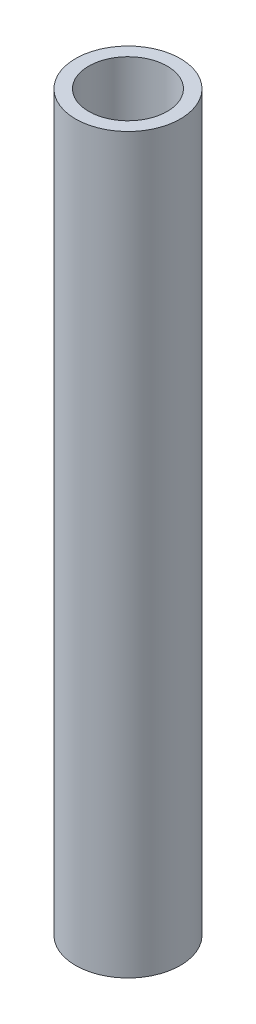
ISO-10303-21;
HEADER;
FILE_DESCRIPTION(('STEP AP214'),'2;1');
FILE_NAME('part.step','',(''),(''),'','','');
FILE_SCHEMA(('AUTOMOTIVE_DESIGN { 1 0 10303 214 1 1 1 1 }'));
ENDSEC;
DATA;
#1=APPLICATION_CONTEXT('core data for automotive mechanical design processes');
#2=APPLICATION_PROTOCOL_DEFINITION('international standard','automotive_design',2000,#1);
#3=PRODUCT_CONTEXT('',#1,'mechanical');
#4=PRODUCT('Part','Part','',(#3));
#5=PRODUCT_RELATED_PRODUCT_CATEGORY('part','',(#4));
#6=PRODUCT_DEFINITION_FORMATION('','',#4);
#7=PRODUCT_DEFINITION_CONTEXT('part definition',#1,'design');
#8=PRODUCT_DEFINITION('design','',#6,#7);
#9=PRODUCT_DEFINITION_SHAPE('','',#8);
#10=(LENGTH_UNIT() NAMED_UNIT(*) SI_UNIT(.MILLI.,.METRE.));
#11=(NAMED_UNIT(*) PLANE_ANGLE_UNIT() SI_UNIT($,.RADIAN.));
#12=(NAMED_UNIT(*) SI_UNIT($,.STERADIAN.) SOLID_ANGLE_UNIT());
#13=UNCERTAINTY_MEASURE_WITH_UNIT(LENGTH_MEASURE(1.E-05),#10,'distance_accuracy_value','');
#14=(GEOMETRIC_REPRESENTATION_CONTEXT(3) GLOBAL_UNCERTAINTY_ASSIGNED_CONTEXT((#13)) GLOBAL_UNIT_ASSIGNED_CONTEXT((#10,
#11,#12)) REPRESENTATION_CONTEXT('',''));
#15=CARTESIAN_POINT('',(0.,0.,0.));
#16=DIRECTION('',(0.,0.,1.));
#17=DIRECTION('',(1.,0.,0.));
#18=AXIS2_PLACEMENT_3D('',#15,#16,#17);
#19=CARTESIAN_POINT('',(0.,177.8,0.));
#20=DIRECTION('',(0.,1.,0.));
#21=DIRECTION('',(0.,0.,1.));
#22=AXIS2_PLACEMENT_3D('',#19,#20,#21);
#23=PLANE('',#22);
#24=CARTESIAN_POINT('',(0.,177.8,0.));
#25=DIRECTION('',(0.,1.,0.));
#26=DIRECTION('',(0.,0.,1.));
#27=AXIS2_PLACEMENT_3D('',#24,#25,#26);
#28=CIRCLE('',#27,12.7);
#29=CARTESIAN_POINT('',(0.,177.8,12.7));
#30=VERTEX_POINT('',#29);
#31=EDGE_CURVE('E10',#30,#30,#28,.T.);
#32=ORIENTED_EDGE('',*,*,#31,.T.);
#33=EDGE_LOOP('',(#32));
#34=FACE_BOUND('',#33,.T.);
#35=CARTESIAN_POINT('',(0.,177.8,0.));
#36=DIRECTION('',(0.,1.,0.));
#37=DIRECTION('',(0.,0.,1.));
#38=AXIS2_PLACEMENT_3D('',#35,#36,#37);
#39=CIRCLE('',#38,9.525);
#40=CARTESIAN_POINT('',(0.,177.8,9.525));
#41=VERTEX_POINT('',#40);
#42=EDGE_CURVE('E52',#41,#41,#39,.T.);
#43=ORIENTED_EDGE('',*,*,#42,.F.);
#44=EDGE_LOOP('',(#43));
#45=FACE_BOUND('',#44,.T.);
#46=ADVANCED_FACE('F39',(#34,#45),#23,.T.);
#47=CARTESIAN_POINT('',(0.,0.,0.));
#48=DIRECTION('',(0.,1.,0.));
#49=DIRECTION('',(0.,0.,1.));
#50=AXIS2_PLACEMENT_3D('',#47,#48,#49);
#51=PLANE('',#50);
#52=CARTESIAN_POINT('',(0.,0.,0.));
#53=DIRECTION('',(0.,1.,0.));
#54=DIRECTION('',(0.,0.,1.));
#55=AXIS2_PLACEMENT_3D('',#52,#53,#54);
#56=CIRCLE('',#55,12.7);
#57=CARTESIAN_POINT('',(0.,0.,12.7));
#58=VERTEX_POINT('',#57);
#59=EDGE_CURVE('E43',#58,#58,#56,.T.);
#60=ORIENTED_EDGE('',*,*,#59,.F.);
#61=EDGE_LOOP('',(#60));
#62=FACE_BOUND('',#61,.T.);
#63=CARTESIAN_POINT('',(0.,0.,0.));
#64=DIRECTION('',(0.,1.,0.));
#65=DIRECTION('',(0.,0.,1.));
#66=AXIS2_PLACEMENT_3D('',#63,#64,#65);
#67=CIRCLE('',#66,9.525);
#68=CARTESIAN_POINT('',(0.,0.,9.525));
#69=VERTEX_POINT('',#68);
#70=EDGE_CURVE('E54',#69,#69,#67,.T.);
#71=ORIENTED_EDGE('',*,*,#70,.T.);
#72=EDGE_LOOP('',(#71));
#73=FACE_BOUND('',#72,.T.);
#74=ADVANCED_FACE('F66',(#62,#73),#51,.F.);
#75=CARTESIAN_POINT('',(0.,177.8,0.));
#76=DIRECTION('',(0.,-1.,0.));
#77=DIRECTION('',(0.,0.,-1.));
#78=AXIS2_PLACEMENT_3D('',#75,#76,#77);
#79=CYLINDRICAL_SURFACE('',#78,12.7);
#80=ORIENTED_EDGE('',*,*,#31,.F.);
#81=EDGE_LOOP('',(#80));
#82=FACE_BOUND('',#81,.T.);
#83=ORIENTED_EDGE('',*,*,#59,.T.);
#84=EDGE_LOOP('',(#83));
#85=FACE_BOUND('',#84,.T.);
#86=ADVANCED_FACE('F41',(#82,#85),#79,.T.);
#87=CARTESIAN_POINT('',(0.,177.8,0.));
#88=DIRECTION('',(0.,-1.,0.));
#89=DIRECTION('',(0.,0.,-1.));
#90=AXIS2_PLACEMENT_3D('',#87,#88,#89);
#91=CYLINDRICAL_SURFACE('',#90,9.525);
#92=ORIENTED_EDGE('',*,*,#42,.T.);
#93=EDGE_LOOP('',(#92));
#94=FACE_BOUND('',#93,.T.);
#95=ORIENTED_EDGE('',*,*,#70,.F.);
#96=EDGE_LOOP('',(#95));
#97=FACE_BOUND('',#96,.T.);
#98=ADVANCED_FACE('F62',(#94,#97),#91,.F.);
#99=CLOSED_SHELL('',(#46,#74,#86,#98));
#100=MANIFOLD_SOLID_BREP('B2',#99);
#101=ADVANCED_BREP_SHAPE_REPRESENTATION('',(#18,#100),#14);
#102=SHAPE_DEFINITION_REPRESENTATION(#9,#101);
ENDSEC;
END-ISO-10303-21;
